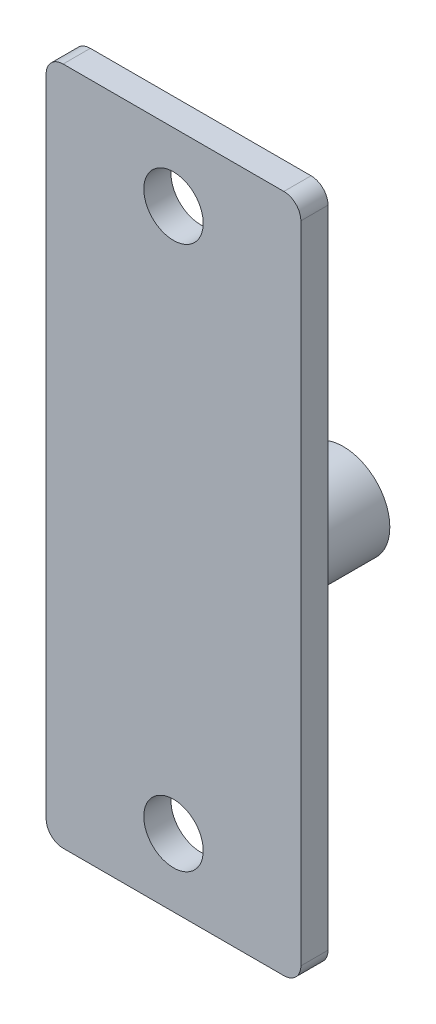
ISO-10303-21;
HEADER;
FILE_DESCRIPTION(('STEP AP214'),'2;1');
FILE_NAME('part.step','',(''),(''),'','','');
FILE_SCHEMA(('AUTOMOTIVE_DESIGN { 1 0 10303 214 1 1 1 1 }'));
ENDSEC;
DATA;
#1=APPLICATION_CONTEXT('core data for automotive mechanical design processes');
#2=APPLICATION_PROTOCOL_DEFINITION('international standard','automotive_design',2000,#1);
#3=PRODUCT_CONTEXT('',#1,'mechanical');
#4=PRODUCT('Part','Part','',(#3));
#5=PRODUCT_RELATED_PRODUCT_CATEGORY('part','',(#4));
#6=PRODUCT_DEFINITION_FORMATION('','',#4);
#7=PRODUCT_DEFINITION_CONTEXT('part definition',#1,'design');
#8=PRODUCT_DEFINITION('design','',#6,#7);
#9=PRODUCT_DEFINITION_SHAPE('','',#8);
#10=(LENGTH_UNIT() NAMED_UNIT(*) SI_UNIT(.MILLI.,.METRE.));
#11=(NAMED_UNIT(*) PLANE_ANGLE_UNIT() SI_UNIT($,.RADIAN.));
#12=(NAMED_UNIT(*) SI_UNIT($,.STERADIAN.) SOLID_ANGLE_UNIT());
#13=UNCERTAINTY_MEASURE_WITH_UNIT(LENGTH_MEASURE(1.E-05),#10,'distance_accuracy_value','');
#14=(GEOMETRIC_REPRESENTATION_CONTEXT(3) GLOBAL_UNCERTAINTY_ASSIGNED_CONTEXT((#13)) GLOBAL_UNIT_ASSIGNED_CONTEXT((#10,
#11,#12)) REPRESENTATION_CONTEXT('',''));
#15=CARTESIAN_POINT('',(0.,0.,0.));
#16=DIRECTION('',(0.,0.,1.));
#17=DIRECTION('',(1.,0.,0.));
#18=AXIS2_PLACEMENT_3D('',#15,#16,#17);
#19=CARTESIAN_POINT('',(0.,0.,1.6));
#20=DIRECTION('',(0.,0.,-1.));
#21=DIRECTION('',(-1.,0.,0.));
#22=AXIS2_PLACEMENT_3D('',#19,#20,#21);
#23=PLANE('',#22);
#24=DIRECTION('',(-1.,0.,0.));
#25=VECTOR('',#24,1.);
#26=CARTESIAN_POINT('',(0.,40.,1.6));
#27=LINE('',#26,#25);
#28=CARTESIAN_POINT('',(14.,40.,1.6));
#29=VERTEX_POINT('',#28);
#30=CARTESIAN_POINT('',(0.999999999999989,40.,1.6));
#31=VERTEX_POINT('',#30);
#32=EDGE_CURVE('E139',#29,#31,#27,.T.);
#33=ORIENTED_EDGE('',*,*,#32,.T.);
#34=CARTESIAN_POINT('',(0.999999999999989,39.,1.6));
#35=DIRECTION('',(0.,0.,-1.));
#36=DIRECTION('',(-1.,0.,0.));
#37=AXIS2_PLACEMENT_3D('',#34,#35,#36);
#38=CIRCLE('',#37,1.);
#39=CARTESIAN_POINT('',(0.,39.,1.6));
#40=VERTEX_POINT('',#39);
#41=EDGE_CURVE('E157',#31,#40,#38,.F.);
#42=ORIENTED_EDGE('',*,*,#41,.T.);
#43=DIRECTION('',(0.,-1.,0.));
#44=VECTOR('',#43,1.);
#45=CARTESIAN_POINT('',(0.,0.,1.6));
#46=LINE('',#45,#44);
#47=CARTESIAN_POINT('',(0.,1.,1.6));
#48=VERTEX_POINT('',#47);
#49=EDGE_CURVE('E121',#40,#48,#46,.T.);
#50=ORIENTED_EDGE('',*,*,#49,.T.);
#51=CARTESIAN_POINT('',(1.,1.,1.6));
#52=DIRECTION('',(0.,0.,-1.));
#53=DIRECTION('',(-1.,0.,0.));
#54=AXIS2_PLACEMENT_3D('',#51,#52,#53);
#55=CIRCLE('',#54,1.);
#56=CARTESIAN_POINT('',(1.,0.,1.6));
#57=VERTEX_POINT('',#56);
#58=EDGE_CURVE('E154',#48,#57,#55,.F.);
#59=ORIENTED_EDGE('',*,*,#58,.T.);
#60=DIRECTION('',(1.,0.,0.));
#61=VECTOR('',#60,1.);
#62=CARTESIAN_POINT('',(0.,0.,1.6));
#63=LINE('',#62,#61);
#64=CARTESIAN_POINT('',(14.,0.,1.6));
#65=VERTEX_POINT('',#64);
#66=EDGE_CURVE('E169',#57,#65,#63,.T.);
#67=ORIENTED_EDGE('',*,*,#66,.T.);
#68=CARTESIAN_POINT('',(14.,0.999999999999999,1.6));
#69=DIRECTION('',(0.,0.,-1.));
#70=DIRECTION('',(-1.,0.,0.));
#71=AXIS2_PLACEMENT_3D('',#68,#69,#70);
#72=CIRCLE('',#71,1.);
#73=CARTESIAN_POINT('',(15.,0.999999999999999,1.6));
#74=VERTEX_POINT('',#73);
#75=EDGE_CURVE('E56',#65,#74,#72,.F.);
#76=ORIENTED_EDGE('',*,*,#75,.T.);
#77=DIRECTION('',(0.,1.,0.));
#78=VECTOR('',#77,1.);
#79=CARTESIAN_POINT('',(15.,0.,1.6));
#80=LINE('',#79,#78);
#81=CARTESIAN_POINT('',(15.,39.,1.6));
#82=VERTEX_POINT('',#81);
#83=EDGE_CURVE('E175',#74,#82,#80,.T.);
#84=ORIENTED_EDGE('',*,*,#83,.T.);
#85=CARTESIAN_POINT('',(14.,39.,1.6));
#86=DIRECTION('',(0.,0.,-1.));
#87=DIRECTION('',(-1.,0.,0.));
#88=AXIS2_PLACEMENT_3D('',#85,#86,#87);
#89=CIRCLE('',#88,1.);
#90=EDGE_CURVE('E152',#82,#29,#89,.F.);
#91=ORIENTED_EDGE('',*,*,#90,.T.);
#92=EDGE_LOOP('',(#33,#42,#50,#59,#67,#76,#84,#91));
#93=FACE_BOUND('',#92,.T.);
#94=CARTESIAN_POINT('',(7.5,4.,1.6));
#95=DIRECTION('',(0.,0.,1.));
#96=DIRECTION('',(1.,0.,0.));
#97=AXIS2_PLACEMENT_3D('',#94,#95,#96);
#98=CIRCLE('',#97,1.75);
#99=CARTESIAN_POINT('',(9.25,4.,1.6));
#100=VERTEX_POINT('',#99);
#101=EDGE_CURVE('E130',#100,#100,#98,.T.);
#102=ORIENTED_EDGE('',*,*,#101,.F.);
#103=EDGE_LOOP('',(#102));
#104=FACE_BOUND('',#103,.T.);
#105=CARTESIAN_POINT('',(7.5,36.,1.6));
#106=DIRECTION('',(0.,0.,1.));
#107=DIRECTION('',(-1.,0.,0.));
#108=AXIS2_PLACEMENT_3D('',#105,#106,#107);
#109=CIRCLE('',#108,1.75);
#110=CARTESIAN_POINT('',(5.75,36.,1.6));
#111=VERTEX_POINT('',#110);
#112=EDGE_CURVE('E190',#111,#111,#109,.T.);
#113=ORIENTED_EDGE('',*,*,#112,.F.);
#114=EDGE_LOOP('',(#113));
#115=FACE_BOUND('',#114,.T.);
#116=ADVANCED_FACE('F34',(#93,#104,#115),#23,.F.);
#117=CARTESIAN_POINT('',(0.,0.,0.));
#118=DIRECTION('',(0.,0.,-1.));
#119=DIRECTION('',(-1.,0.,0.));
#120=AXIS2_PLACEMENT_3D('',#117,#118,#119);
#121=PLANE('',#120);
#122=CARTESIAN_POINT('',(7.5,16.,0.));
#123=DIRECTION('',(0.,0.,-1.));
#124=DIRECTION('',(-1.,0.,0.));
#125=AXIS2_PLACEMENT_3D('',#122,#123,#124);
#126=CIRCLE('',#125,2.74069020121288);
#127=CARTESIAN_POINT('',(4.75930979878712,16.,0.));
#128=VERTEX_POINT('',#127);
#129=EDGE_CURVE('E11',#128,#128,#126,.T.);
#130=ORIENTED_EDGE('',*,*,#129,.F.);
#131=EDGE_LOOP('',(#130));
#132=FACE_BOUND('',#131,.T.);
#133=CARTESIAN_POINT('',(7.5,4.,0.));
#134=DIRECTION('',(0.,0.,1.));
#135=DIRECTION('',(1.,0.,0.));
#136=AXIS2_PLACEMENT_3D('',#133,#134,#135);
#137=CIRCLE('',#136,1.75);
#138=CARTESIAN_POINT('',(9.25,4.,0.));
#139=VERTEX_POINT('',#138);
#140=EDGE_CURVE('E136',#139,#139,#137,.T.);
#141=ORIENTED_EDGE('',*,*,#140,.T.);
#142=EDGE_LOOP('',(#141));
#143=FACE_BOUND('',#142,.T.);
#144=DIRECTION('',(0.,-1.,0.));
#145=VECTOR('',#144,1.);
#146=CARTESIAN_POINT('',(0.,0.,0.));
#147=LINE('',#146,#145);
#148=CARTESIAN_POINT('',(0.,39.,0.));
#149=VERTEX_POINT('',#148);
#150=CARTESIAN_POINT('',(0.,1.,0.));
#151=VERTEX_POINT('',#150);
#152=EDGE_CURVE('E118',#149,#151,#147,.T.);
#153=ORIENTED_EDGE('',*,*,#152,.F.);
#154=CARTESIAN_POINT('',(0.999999999999989,39.,0.));
#155=DIRECTION('',(0.,0.,-1.));
#156=DIRECTION('',(-1.,0.,0.));
#157=AXIS2_PLACEMENT_3D('',#154,#155,#156);
#158=CIRCLE('',#157,1.);
#159=CARTESIAN_POINT('',(0.999999999999989,40.,0.));
#160=VERTEX_POINT('',#159);
#161=EDGE_CURVE('E101',#149,#160,#158,.T.);
#162=ORIENTED_EDGE('',*,*,#161,.T.);
#163=DIRECTION('',(-1.,0.,0.));
#164=VECTOR('',#163,1.);
#165=CARTESIAN_POINT('',(0.,40.,0.));
#166=LINE('',#165,#164);
#167=CARTESIAN_POINT('',(14.,40.,0.));
#168=VERTEX_POINT('',#167);
#169=EDGE_CURVE('E143',#168,#160,#166,.T.);
#170=ORIENTED_EDGE('',*,*,#169,.F.);
#171=CARTESIAN_POINT('',(14.,39.,0.));
#172=DIRECTION('',(0.,0.,-1.));
#173=DIRECTION('',(-1.,0.,0.));
#174=AXIS2_PLACEMENT_3D('',#171,#172,#173);
#175=CIRCLE('',#174,1.);
#176=CARTESIAN_POINT('',(15.,39.,0.));
#177=VERTEX_POINT('',#176);
#178=EDGE_CURVE('E122',#168,#177,#175,.T.);
#179=ORIENTED_EDGE('',*,*,#178,.T.);
#180=DIRECTION('',(0.,1.,0.));
#181=VECTOR('',#180,1.);
#182=CARTESIAN_POINT('',(15.,0.,0.));
#183=LINE('',#182,#181);
#184=CARTESIAN_POINT('',(15.,0.999999999999999,0.));
#185=VERTEX_POINT('',#184);
#186=EDGE_CURVE('E133',#185,#177,#183,.T.);
#187=ORIENTED_EDGE('',*,*,#186,.F.);
#188=CARTESIAN_POINT('',(14.,0.999999999999999,0.));
#189=DIRECTION('',(0.,0.,-1.));
#190=DIRECTION('',(-1.,0.,0.));
#191=AXIS2_PLACEMENT_3D('',#188,#189,#190);
#192=CIRCLE('',#191,1.);
#193=CARTESIAN_POINT('',(14.,0.,0.));
#194=VERTEX_POINT('',#193);
#195=EDGE_CURVE('E112',#185,#194,#192,.T.);
#196=ORIENTED_EDGE('',*,*,#195,.T.);
#197=DIRECTION('',(1.,0.,0.));
#198=VECTOR('',#197,1.);
#199=CARTESIAN_POINT('',(0.,0.,0.));
#200=LINE('',#199,#198);
#201=CARTESIAN_POINT('',(1.,0.,0.));
#202=VERTEX_POINT('',#201);
#203=EDGE_CURVE('E129',#202,#194,#200,.T.);
#204=ORIENTED_EDGE('',*,*,#203,.F.);
#205=CARTESIAN_POINT('',(1.,1.,0.));
#206=DIRECTION('',(0.,0.,-1.));
#207=DIRECTION('',(-1.,0.,0.));
#208=AXIS2_PLACEMENT_3D('',#205,#206,#207);
#209=CIRCLE('',#208,1.);
#210=EDGE_CURVE('E128',#202,#151,#209,.T.);
#211=ORIENTED_EDGE('',*,*,#210,.T.);
#212=EDGE_LOOP('',(#153,#162,#170,#179,#187,#196,#204,#211));
#213=FACE_BOUND('',#212,.T.);
#214=CARTESIAN_POINT('',(7.5,36.,0.));
#215=DIRECTION('',(0.,0.,1.));
#216=DIRECTION('',(-1.,0.,0.));
#217=AXIS2_PLACEMENT_3D('',#214,#215,#216);
#218=CIRCLE('',#217,1.75);
#219=CARTESIAN_POINT('',(5.75,36.,0.));
#220=VERTEX_POINT('',#219);
#221=EDGE_CURVE('E192',#220,#220,#218,.T.);
#222=ORIENTED_EDGE('',*,*,#221,.T.);
#223=EDGE_LOOP('',(#222));
#224=FACE_BOUND('',#223,.T.);
#225=ADVANCED_FACE('F125',(#132,#143,#213,#224),#121,.T.);
#226=CARTESIAN_POINT('',(0.,0.,1.6));
#227=DIRECTION('',(1.,0.,0.));
#228=DIRECTION('',(0.,1.,0.));
#229=AXIS2_PLACEMENT_3D('',#226,#227,#228);
#230=PLANE('',#229);
#231=ORIENTED_EDGE('',*,*,#49,.F.);
#232=DIRECTION('',(0.,0.,-1.));
#233=VECTOR('',#232,1.);
#234=CARTESIAN_POINT('',(0.,39.,1.6));
#235=LINE('',#234,#233);
#236=EDGE_CURVE('E105',#40,#149,#235,.T.);
#237=ORIENTED_EDGE('',*,*,#236,.T.);
#238=ORIENTED_EDGE('',*,*,#152,.T.);
#239=DIRECTION('',(0.,0.,-1.));
#240=VECTOR('',#239,1.);
#241=CARTESIAN_POINT('',(0.,1.,1.6));
#242=LINE('',#241,#240);
#243=EDGE_CURVE('E123',#151,#48,#242,.F.);
#244=ORIENTED_EDGE('',*,*,#243,.T.);
#245=EDGE_LOOP('',(#231,#237,#238,#244));
#246=FACE_BOUND('',#245,.T.);
#247=ADVANCED_FACE('F117',(#246),#230,.F.);
#248=CARTESIAN_POINT('',(0.,0.,1.6));
#249=DIRECTION('',(0.,1.,0.));
#250=DIRECTION('',(-1.,0.,0.));
#251=AXIS2_PLACEMENT_3D('',#248,#249,#250);
#252=PLANE('',#251);
#253=ORIENTED_EDGE('',*,*,#203,.T.);
#254=DIRECTION('',(0.,0.,-1.));
#255=VECTOR('',#254,1.);
#256=CARTESIAN_POINT('',(14.,0.,1.6));
#257=LINE('',#256,#255);
#258=EDGE_CURVE('E42',#194,#65,#257,.F.);
#259=ORIENTED_EDGE('',*,*,#258,.T.);
#260=ORIENTED_EDGE('',*,*,#66,.F.);
#261=DIRECTION('',(0.,0.,-1.));
#262=VECTOR('',#261,1.);
#263=CARTESIAN_POINT('',(1.,0.,1.6));
#264=LINE('',#263,#262);
#265=EDGE_CURVE('E163',#57,#202,#264,.T.);
#266=ORIENTED_EDGE('',*,*,#265,.T.);
#267=EDGE_LOOP('',(#253,#259,#260,#266));
#268=FACE_BOUND('',#267,.T.);
#269=ADVANCED_FACE('F168',(#268),#252,.F.);
#270=CARTESIAN_POINT('',(15.,0.,1.6));
#271=DIRECTION('',(-1.,0.,0.));
#272=DIRECTION('',(0.,0.,1.));
#273=AXIS2_PLACEMENT_3D('',#270,#271,#272);
#274=PLANE('',#273);
#275=ORIENTED_EDGE('',*,*,#83,.F.);
#276=DIRECTION('',(0.,0.,-1.));
#277=VECTOR('',#276,1.);
#278=CARTESIAN_POINT('',(15.,0.999999999999999,1.6));
#279=LINE('',#278,#277);
#280=EDGE_CURVE('E160',#74,#185,#279,.T.);
#281=ORIENTED_EDGE('',*,*,#280,.T.);
#282=ORIENTED_EDGE('',*,*,#186,.T.);
#283=DIRECTION('',(0.,0.,-1.));
#284=VECTOR('',#283,1.);
#285=CARTESIAN_POINT('',(15.,39.,1.6));
#286=LINE('',#285,#284);
#287=EDGE_CURVE('E49',#177,#82,#286,.F.);
#288=ORIENTED_EDGE('',*,*,#287,.T.);
#289=EDGE_LOOP('',(#275,#281,#282,#288));
#290=FACE_BOUND('',#289,.T.);
#291=ADVANCED_FACE('F180',(#290),#274,.F.);
#292=CARTESIAN_POINT('',(0.,40.,1.6));
#293=DIRECTION('',(0.,-1.,0.));
#294=DIRECTION('',(1.,0.,0.));
#295=AXIS2_PLACEMENT_3D('',#292,#293,#294);
#296=PLANE('',#295);
#297=ORIENTED_EDGE('',*,*,#169,.T.);
#298=DIRECTION('',(0.,0.,-1.));
#299=VECTOR('',#298,1.);
#300=CARTESIAN_POINT('',(0.999999999999989,40.,1.6));
#301=LINE('',#300,#299);
#302=EDGE_CURVE('E106',#160,#31,#301,.F.);
#303=ORIENTED_EDGE('',*,*,#302,.T.);
#304=ORIENTED_EDGE('',*,*,#32,.F.);
#305=DIRECTION('',(0.,0.,-1.));
#306=VECTOR('',#305,1.);
#307=CARTESIAN_POINT('',(14.,40.,1.6));
#308=LINE('',#307,#306);
#309=EDGE_CURVE('E111',#29,#168,#308,.T.);
#310=ORIENTED_EDGE('',*,*,#309,.T.);
#311=EDGE_LOOP('',(#297,#303,#304,#310));
#312=FACE_BOUND('',#311,.T.);
#313=ADVANCED_FACE('F186',(#312),#296,.F.);
#314=CARTESIAN_POINT('',(7.5,4.,1.6));
#315=DIRECTION('',(0.,0.,-1.));
#316=DIRECTION('',(-1.,0.,0.));
#317=AXIS2_PLACEMENT_3D('',#314,#315,#316);
#318=CYLINDRICAL_SURFACE('',#317,1.75);
#319=ORIENTED_EDGE('',*,*,#101,.T.);
#320=EDGE_LOOP('',(#319));
#321=FACE_BOUND('',#320,.T.);
#322=ORIENTED_EDGE('',*,*,#140,.F.);
#323=EDGE_LOOP('',(#322));
#324=FACE_BOUND('',#323,.T.);
#325=ADVANCED_FACE('F219',(#321,#324),#318,.F.);
#326=CARTESIAN_POINT('',(7.5,36.,1.6));
#327=DIRECTION('',(0.,0.,-1.));
#328=DIRECTION('',(-1.,0.,0.));
#329=AXIS2_PLACEMENT_3D('',#326,#327,#328);
#330=CYLINDRICAL_SURFACE('',#329,1.75);
#331=ORIENTED_EDGE('',*,*,#112,.T.);
#332=EDGE_LOOP('',(#331));
#333=FACE_BOUND('',#332,.T.);
#334=ORIENTED_EDGE('',*,*,#221,.F.);
#335=EDGE_LOOP('',(#334));
#336=FACE_BOUND('',#335,.T.);
#337=ADVANCED_FACE('F232',(#333,#336),#330,.F.);
#338=CARTESIAN_POINT('',(0.999999999999989,39.,1.6));
#339=DIRECTION('',(0.,0.,-1.));
#340=DIRECTION('',(-1.,0.,0.));
#341=AXIS2_PLACEMENT_3D('',#338,#339,#340);
#342=CYLINDRICAL_SURFACE('',#341,1.);
#343=ORIENTED_EDGE('',*,*,#41,.F.);
#344=ORIENTED_EDGE('',*,*,#302,.F.);
#345=ORIENTED_EDGE('',*,*,#161,.F.);
#346=ORIENTED_EDGE('',*,*,#236,.F.);
#347=EDGE_LOOP('',(#343,#344,#345,#346));
#348=FACE_BOUND('',#347,.T.);
#349=ADVANCED_FACE('F104',(#348),#342,.T.);
#350=CARTESIAN_POINT('',(14.,0.999999999999999,1.6));
#351=DIRECTION('',(0.,0.,-1.));
#352=DIRECTION('',(-1.,0.,0.));
#353=AXIS2_PLACEMENT_3D('',#350,#351,#352);
#354=CYLINDRICAL_SURFACE('',#353,1.);
#355=ORIENTED_EDGE('',*,*,#75,.F.);
#356=ORIENTED_EDGE('',*,*,#258,.F.);
#357=ORIENTED_EDGE('',*,*,#195,.F.);
#358=ORIENTED_EDGE('',*,*,#280,.F.);
#359=EDGE_LOOP('',(#355,#356,#357,#358));
#360=FACE_BOUND('',#359,.T.);
#361=ADVANCED_FACE('F178',(#360),#354,.T.);
#362=CARTESIAN_POINT('',(1.,1.,1.6));
#363=DIRECTION('',(0.,0.,-1.));
#364=DIRECTION('',(-1.,0.,0.));
#365=AXIS2_PLACEMENT_3D('',#362,#363,#364);
#366=CYLINDRICAL_SURFACE('',#365,1.);
#367=ORIENTED_EDGE('',*,*,#58,.F.);
#368=ORIENTED_EDGE('',*,*,#243,.F.);
#369=ORIENTED_EDGE('',*,*,#210,.F.);
#370=ORIENTED_EDGE('',*,*,#265,.F.);
#371=EDGE_LOOP('',(#367,#368,#369,#370));
#372=FACE_BOUND('',#371,.T.);
#373=ADVANCED_FACE('F234',(#372),#366,.T.);
#374=CARTESIAN_POINT('',(14.,39.,1.6));
#375=DIRECTION('',(0.,0.,-1.));
#376=DIRECTION('',(-1.,0.,0.));
#377=AXIS2_PLACEMENT_3D('',#374,#375,#376);
#378=CYLINDRICAL_SURFACE('',#377,1.);
#379=ORIENTED_EDGE('',*,*,#90,.F.);
#380=ORIENTED_EDGE('',*,*,#287,.F.);
#381=ORIENTED_EDGE('',*,*,#178,.F.);
#382=ORIENTED_EDGE('',*,*,#309,.F.);
#383=EDGE_LOOP('',(#379,#380,#381,#382));
#384=FACE_BOUND('',#383,.T.);
#385=ADVANCED_FACE('F36',(#384),#378,.T.);
#386=CARTESIAN_POINT('',(7.5,16.,-8.4));
#387=DIRECTION('',(0.,0.,1.));
#388=DIRECTION('',(1.,0.,0.));
#389=AXIS2_PLACEMENT_3D('',#386,#387,#388);
#390=CYLINDRICAL_SURFACE('',#389,2.74069020121288);
#391=ORIENTED_EDGE('',*,*,#129,.T.);
#392=EDGE_LOOP('',(#391));
#393=FACE_BOUND('',#392,.T.);
#394=CARTESIAN_POINT('',(7.5,16.,-8.4));
#395=DIRECTION('',(0.,0.,1.));
#396=DIRECTION('',(1.,0.,0.));
#397=AXIS2_PLACEMENT_3D('',#394,#395,#396);
#398=CIRCLE('',#397,2.74069020121288);
#399=CARTESIAN_POINT('',(10.2406902012129,16.,-8.4));
#400=VERTEX_POINT('',#399);
#401=EDGE_CURVE('E195',#400,#400,#398,.T.);
#402=ORIENTED_EDGE('',*,*,#401,.T.);
#403=EDGE_LOOP('',(#402));
#404=FACE_BOUND('',#403,.T.);
#405=ADVANCED_FACE('F201',(#393,#404),#390,.T.);
#406=CARTESIAN_POINT('',(7.5,16.,-8.4));
#407=DIRECTION('',(0.,0.,1.));
#408=DIRECTION('',(1.,0.,0.));
#409=AXIS2_PLACEMENT_3D('',#406,#407,#408);
#410=PLANE('',#409);
#411=ORIENTED_EDGE('',*,*,#401,.F.);
#412=EDGE_LOOP('',(#411));
#413=FACE_BOUND('',#412,.T.);
#414=ADVANCED_FACE('F203',(#413),#410,.F.);
#415=CLOSED_SHELL('',(#116,#225,#247,#269,#291,#313,#325,#337,#349,#361,#373,#385,#405,#414));
#416=MANIFOLD_SOLID_BREP('B2',#415);
#417=ADVANCED_BREP_SHAPE_REPRESENTATION('',(#18,#416),#14);
#418=SHAPE_DEFINITION_REPRESENTATION(#9,#417);
ENDSEC;
END-ISO-10303-21;
